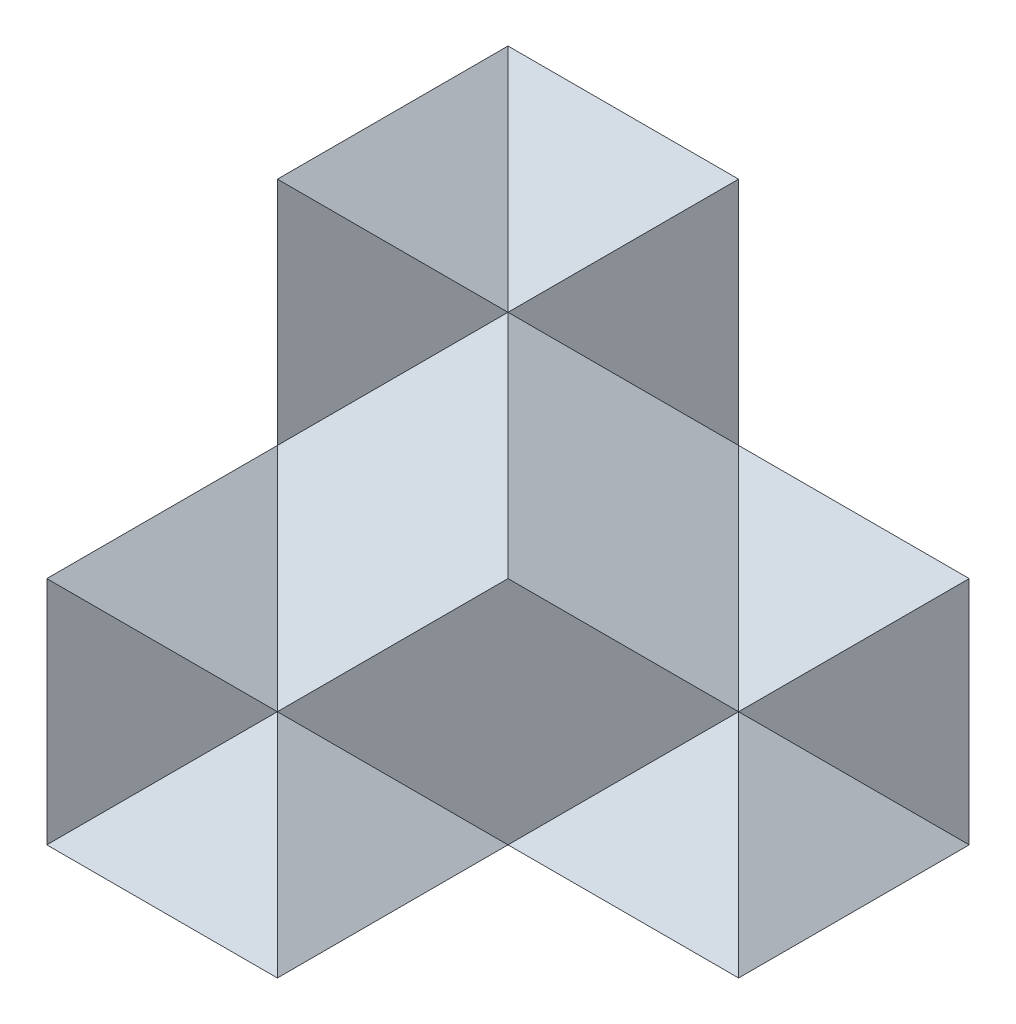
ISO-10303-21;
HEADER;
FILE_DESCRIPTION(('STEP AP214'),'2;1');
FILE_NAME('part.step','',(''),(''),'','','');
FILE_SCHEMA(('AUTOMOTIVE_DESIGN { 1 0 10303 214 1 1 1 1 }'));
ENDSEC;
DATA;
#1=APPLICATION_CONTEXT('core data for automotive mechanical design processes');
#2=APPLICATION_PROTOCOL_DEFINITION('international standard','automotive_design',2000,#1);
#3=PRODUCT_CONTEXT('',#1,'mechanical');
#4=PRODUCT('Part','Part','',(#3));
#5=PRODUCT_RELATED_PRODUCT_CATEGORY('part','',(#4));
#6=PRODUCT_DEFINITION_FORMATION('','',#4);
#7=PRODUCT_DEFINITION_CONTEXT('part definition',#1,'design');
#8=PRODUCT_DEFINITION('design','',#6,#7);
#9=PRODUCT_DEFINITION_SHAPE('','',#8);
#10=(LENGTH_UNIT() NAMED_UNIT(*) SI_UNIT(.MILLI.,.METRE.));
#11=(NAMED_UNIT(*) PLANE_ANGLE_UNIT() SI_UNIT($,.RADIAN.));
#12=(NAMED_UNIT(*) SI_UNIT($,.STERADIAN.) SOLID_ANGLE_UNIT());
#13=UNCERTAINTY_MEASURE_WITH_UNIT(LENGTH_MEASURE(1.E-05),#10,'distance_accuracy_value','');
#14=(GEOMETRIC_REPRESENTATION_CONTEXT(3) GLOBAL_UNCERTAINTY_ASSIGNED_CONTEXT((#13)) GLOBAL_UNIT_ASSIGNED_CONTEXT((#10,
#11,#12)) REPRESENTATION_CONTEXT('',''));
#15=CARTESIAN_POINT('',(0.,0.,0.));
#16=DIRECTION('',(0.,0.,1.));
#17=DIRECTION('',(1.,0.,0.));
#18=AXIS2_PLACEMENT_3D('',#15,#16,#17);
#19=CARTESIAN_POINT('',(25.4,0.,50.8));
#20=DIRECTION('',(0.707106781186546,0.707106781186549,0.));
#21=DIRECTION('',(0.707106781186549,-0.707106781186546,0.));
#22=AXIS2_PLACEMENT_3D('',#19,#20,#21);
#23=PLANE('',#22);
#24=DIRECTION('',(0.,0.,-1.));
#25=VECTOR('',#24,1.);
#26=CARTESIAN_POINT('',(25.4,0.,50.8));
#27=LINE('',#26,#25);
#28=CARTESIAN_POINT('',(25.4,0.,50.8));
#29=VERTEX_POINT('',#28);
#30=CARTESIAN_POINT('',(25.4,0.,25.4));
#31=VERTEX_POINT('',#30);
#32=EDGE_CURVE('E212',#29,#31,#27,.T.);
#33=ORIENTED_EDGE('',*,*,#32,.T.);
#34=DIRECTION('',(0.577350269189627,-0.577350269189626,-0.577350269189625));
#35=VECTOR('',#34,1.);
#36=CARTESIAN_POINT('',(16.9333333333333,8.46666666666668,33.8666666666667));
#37=LINE('',#36,#35);
#38=CARTESIAN_POINT('',(12.7,12.7,38.1));
#39=VERTEX_POINT('',#38);
#40=EDGE_CURVE('E226',#39,#31,#37,.T.);
#41=ORIENTED_EDGE('',*,*,#40,.F.);
#42=DIRECTION('',(0.577350269189627,-0.577350269189622,0.577350269189629));
#43=VECTOR('',#42,1.);
#44=CARTESIAN_POINT('',(25.4,0.,50.8));
#45=LINE('',#44,#43);
#46=EDGE_CURVE('E225',#39,#29,#45,.T.);
#47=ORIENTED_EDGE('',*,*,#46,.T.);
#48=EDGE_LOOP('',(#33,#41,#47));
#49=FACE_BOUND('',#48,.T.);
#50=ADVANCED_FACE('F40',(#49),#23,.T.);
#51=CARTESIAN_POINT('',(0.,0.,50.8));
#52=DIRECTION('',(0.,0.707106781186551,0.707106781186544));
#53=DIRECTION('',(0.,-0.707106781186544,0.707106781186551));
#54=AXIS2_PLACEMENT_3D('',#51,#52,#53);
#55=PLANE('',#54);
#56=DIRECTION('',(1.,0.,0.));
#57=VECTOR('',#56,1.);
#58=CARTESIAN_POINT('',(0.,0.,50.8));
#59=LINE('',#58,#57);
#60=CARTESIAN_POINT('',(0.,0.,50.8));
#61=VERTEX_POINT('',#60);
#62=EDGE_CURVE('E221',#61,#29,#59,.T.);
#63=ORIENTED_EDGE('',*,*,#62,.T.);
#64=ORIENTED_EDGE('',*,*,#46,.F.);
#65=DIRECTION('',(-0.577350269189627,-0.577350269189622,0.577350269189629));
#66=VECTOR('',#65,1.);
#67=CARTESIAN_POINT('',(0.,0.,50.8));
#68=LINE('',#67,#66);
#69=EDGE_CURVE('E231',#39,#61,#68,.T.);
#70=ORIENTED_EDGE('',*,*,#69,.T.);
#71=EDGE_LOOP('',(#63,#64,#70));
#72=FACE_BOUND('',#71,.T.);
#73=ADVANCED_FACE('F245',(#72),#55,.T.);
#74=CARTESIAN_POINT('',(0.,0.,50.8));
#75=DIRECTION('',(0.,-1.,0.));
#76=DIRECTION('',(-1.,0.,0.));
#77=AXIS2_PLACEMENT_3D('',#74,#75,#76);
#78=PLANE('',#77);
#79=ORIENTED_EDGE('',*,*,#32,.F.);
#80=ORIENTED_EDGE('',*,*,#62,.F.);
#81=DIRECTION('',(0.,0.,1.));
#82=VECTOR('',#81,1.);
#83=CARTESIAN_POINT('',(0.,0.,50.8));
#84=LINE('',#83,#82);
#85=CARTESIAN_POINT('',(0.,0.,0.));
#86=VERTEX_POINT('',#85);
#87=EDGE_CURVE('E218',#86,#61,#84,.T.);
#88=ORIENTED_EDGE('',*,*,#87,.F.);
#89=DIRECTION('',(1.,0.,0.));
#90=VECTOR('',#89,1.);
#91=CARTESIAN_POINT('',(0.,0.,0.));
#92=LINE('',#91,#90);
#93=CARTESIAN_POINT('',(50.8,0.,0.));
#94=VERTEX_POINT('',#93);
#95=EDGE_CURVE('E206',#86,#94,#92,.T.);
#96=ORIENTED_EDGE('',*,*,#95,.T.);
#97=DIRECTION('',(0.,0.,-1.));
#98=VECTOR('',#97,1.);
#99=CARTESIAN_POINT('',(50.8,0.,25.4));
#100=LINE('',#99,#98);
#101=CARTESIAN_POINT('',(50.8,0.,25.4));
#102=VERTEX_POINT('',#101);
#103=EDGE_CURVE('E179',#102,#94,#100,.T.);
#104=ORIENTED_EDGE('',*,*,#103,.F.);
#105=DIRECTION('',(1.,0.,0.));
#106=VECTOR('',#105,1.);
#107=CARTESIAN_POINT('',(25.4,0.,25.4));
#108=LINE('',#107,#106);
#109=EDGE_CURVE('E185',#31,#102,#108,.T.);
#110=ORIENTED_EDGE('',*,*,#109,.F.);
#111=EDGE_LOOP('',(#79,#80,#88,#96,#104,#110));
#112=FACE_BOUND('',#111,.T.);
#113=ADVANCED_FACE('F249',(#112),#78,.T.);
#114=CARTESIAN_POINT('',(25.4,0.,25.4));
#115=DIRECTION('',(0.707106781186546,0.,0.707106781186549));
#116=DIRECTION('',(0.707106781186549,0.,-0.707106781186546));
#117=AXIS2_PLACEMENT_3D('',#114,#115,#116);
#118=PLANE('',#117);
#119=ORIENTED_EDGE('',*,*,#40,.T.);
#120=DIRECTION('',(-0.577350269189627,-0.577350269189622,0.577350269189629));
#121=VECTOR('',#120,1.);
#122=CARTESIAN_POINT('',(25.4,0.,25.4));
#123=LINE('',#122,#121);
#124=CARTESIAN_POINT('',(38.1000000000001,12.7,12.7));
#125=VERTEX_POINT('',#124);
#126=EDGE_CURVE('E195',#125,#31,#123,.T.);
#127=ORIENTED_EDGE('',*,*,#126,.F.);
#128=DIRECTION('',(-0.577350269189622,0.577350269189627,0.577350269189629));
#129=VECTOR('',#128,1.);
#130=CARTESIAN_POINT('',(33.8666666666668,16.9333333333333,16.9333333333333));
#131=LINE('',#130,#129);
#132=CARTESIAN_POINT('',(25.4,25.4,25.4));
#133=VERTEX_POINT('',#132);
#134=EDGE_CURVE('E194',#125,#133,#131,.T.);
#135=ORIENTED_EDGE('',*,*,#134,.T.);
#136=DIRECTION('',(0.577350269189627,0.577350269189627,-0.577350269189624));
#137=VECTOR('',#136,1.);
#138=CARTESIAN_POINT('',(16.9333333333333,16.9333333333333,33.8666666666667));
#139=LINE('',#138,#137);
#140=EDGE_CURVE('E136',#39,#133,#139,.T.);
#141=ORIENTED_EDGE('',*,*,#140,.F.);
#142=EDGE_LOOP('',(#119,#127,#135,#141));
#143=FACE_BOUND('',#142,.T.);
#144=ADVANCED_FACE('F255',(#143),#118,.T.);
#145=CARTESIAN_POINT('',(0.,25.4,25.4));
#146=DIRECTION('',(0.,0.707106781186546,0.707106781186549));
#147=DIRECTION('',(0.,-0.707106781186549,0.707106781186546));
#148=AXIS2_PLACEMENT_3D('',#145,#146,#147);
#149=PLANE('',#148);
#150=ORIENTED_EDGE('',*,*,#140,.T.);
#151=DIRECTION('',(0.577350269189627,-0.577350269189622,0.577350269189629));
#152=VECTOR('',#151,1.);
#153=CARTESIAN_POINT('',(25.4,25.4000000000001,25.4));
#154=LINE('',#153,#152);
#155=CARTESIAN_POINT('',(12.7,38.1000000000001,12.7));
#156=VERTEX_POINT('',#155);
#157=EDGE_CURVE('E129',#156,#133,#154,.T.);
#158=ORIENTED_EDGE('',*,*,#157,.F.);
#159=DIRECTION('',(-0.577350269189627,-0.577350269189622,0.577350269189629));
#160=VECTOR('',#159,1.);
#161=CARTESIAN_POINT('',(0.,25.4000000000001,25.4));
#162=LINE('',#161,#160);
#163=CARTESIAN_POINT('',(0.,25.4,25.4));
#164=VERTEX_POINT('',#163);
#165=EDGE_CURVE('E121',#156,#164,#162,.T.);
#166=ORIENTED_EDGE('',*,*,#165,.T.);
#167=DIRECTION('',(-0.577350269189627,0.577350269189627,-0.577350269189624));
#168=VECTOR('',#167,1.);
#169=CARTESIAN_POINT('',(8.46666666666669,16.9333333333333,33.8666666666667));
#170=LINE('',#169,#168);
#171=EDGE_CURVE('E209',#39,#164,#170,.T.);
#172=ORIENTED_EDGE('',*,*,#171,.F.);
#173=EDGE_LOOP('',(#150,#158,#166,#172));
#174=FACE_BOUND('',#173,.T.);
#175=ADVANCED_FACE('F134',(#174),#149,.T.);
#176=CARTESIAN_POINT('',(0.,25.4,50.8));
#177=DIRECTION('',(0.707106781186549,0.707106781186546,0.));
#178=DIRECTION('',(0.707106781186546,-0.707106781186549,0.));
#179=AXIS2_PLACEMENT_3D('',#176,#177,#178);
#180=PLANE('',#179);
#181=DIRECTION('',(0.,0.,1.));
#182=VECTOR('',#181,1.);
#183=CARTESIAN_POINT('',(0.,25.4,50.8));
#184=LINE('',#183,#182);
#185=CARTESIAN_POINT('',(0.,25.4,50.8));
#186=VERTEX_POINT('',#185);
#187=EDGE_CURVE('E230',#164,#186,#184,.T.);
#188=ORIENTED_EDGE('',*,*,#187,.T.);
#189=DIRECTION('',(-0.577350269189622,0.577350269189627,0.577350269189629));
#190=VECTOR('',#189,1.);
#191=CARTESIAN_POINT('',(8.46666666666672,16.9333333333333,42.3333333333333));
#192=LINE('',#191,#190);
#193=EDGE_CURVE('E11',#39,#186,#192,.T.);
#194=ORIENTED_EDGE('',*,*,#193,.F.);
#195=ORIENTED_EDGE('',*,*,#171,.T.);
#196=EDGE_LOOP('',(#188,#194,#195));
#197=FACE_BOUND('',#196,.T.);
#198=ADVANCED_FACE('F42',(#197),#180,.T.);
#199=CARTESIAN_POINT('',(0.,0.,50.8));
#200=DIRECTION('',(0.707106781186551,0.,0.707106781186544));
#201=DIRECTION('',(0.707106781186544,0.,-0.707106781186551));
#202=AXIS2_PLACEMENT_3D('',#199,#200,#201);
#203=PLANE('',#202);
#204=DIRECTION('',(0.,-1.,0.));
#205=VECTOR('',#204,1.);
#206=CARTESIAN_POINT('',(0.,0.,50.8));
#207=LINE('',#206,#205);
#208=EDGE_CURVE('E49',#186,#61,#207,.T.);
#209=ORIENTED_EDGE('',*,*,#208,.T.);
#210=ORIENTED_EDGE('',*,*,#69,.F.);
#211=ORIENTED_EDGE('',*,*,#193,.T.);
#212=EDGE_LOOP('',(#209,#210,#211));
#213=FACE_BOUND('',#212,.T.);
#214=ADVANCED_FACE('F240',(#213),#203,.T.);
#215=CARTESIAN_POINT('',(0.,0.,50.8));
#216=DIRECTION('',(-1.,0.,0.));
#217=DIRECTION('',(0.,0.,1.));
#218=AXIS2_PLACEMENT_3D('',#215,#216,#217);
#219=PLANE('',#218);
#220=ORIENTED_EDGE('',*,*,#187,.F.);
#221=DIRECTION('',(0.,-1.,0.));
#222=VECTOR('',#221,1.);
#223=CARTESIAN_POINT('',(0.,25.4,25.4));
#224=LINE('',#223,#222);
#225=CARTESIAN_POINT('',(0.,50.8,25.4));
#226=VERTEX_POINT('',#225);
#227=EDGE_CURVE('E118',#226,#164,#224,.T.);
#228=ORIENTED_EDGE('',*,*,#227,.F.);
#229=DIRECTION('',(0.,0.,1.));
#230=VECTOR('',#229,1.);
#231=CARTESIAN_POINT('',(0.,50.8,25.4));
#232=LINE('',#231,#230);
#233=CARTESIAN_POINT('',(0.,50.8,0.));
#234=VERTEX_POINT('',#233);
#235=EDGE_CURVE('E113',#234,#226,#232,.T.);
#236=ORIENTED_EDGE('',*,*,#235,.F.);
#237=DIRECTION('',(0.,-1.,0.));
#238=VECTOR('',#237,1.);
#239=CARTESIAN_POINT('',(0.,0.,0.));
#240=LINE('',#239,#238);
#241=EDGE_CURVE('E202',#234,#86,#240,.T.);
#242=ORIENTED_EDGE('',*,*,#241,.T.);
#243=ORIENTED_EDGE('',*,*,#87,.T.);
#244=ORIENTED_EDGE('',*,*,#208,.F.);
#245=EDGE_LOOP('',(#220,#228,#236,#242,#243,#244));
#246=FACE_BOUND('',#245,.T.);
#247=ADVANCED_FACE('F271',(#246),#219,.T.);
#248=CARTESIAN_POINT('',(0.,0.,0.));
#249=DIRECTION('',(0.,0.,-1.));
#250=DIRECTION('',(-1.,0.,0.));
#251=AXIS2_PLACEMENT_3D('',#248,#249,#250);
#252=PLANE('',#251);
#253=ORIENTED_EDGE('',*,*,#241,.F.);
#254=DIRECTION('',(-1.,0.,0.));
#255=VECTOR('',#254,1.);
#256=CARTESIAN_POINT('',(0.,50.8,0.));
#257=LINE('',#256,#255);
#258=CARTESIAN_POINT('',(25.4,50.8,0.));
#259=VERTEX_POINT('',#258);
#260=EDGE_CURVE('E151',#259,#234,#257,.T.);
#261=ORIENTED_EDGE('',*,*,#260,.F.);
#262=DIRECTION('',(0.,1.,0.));
#263=VECTOR('',#262,1.);
#264=CARTESIAN_POINT('',(25.4,25.4,0.));
#265=LINE('',#264,#263);
#266=CARTESIAN_POINT('',(25.4,25.4,0.));
#267=VERTEX_POINT('',#266);
#268=EDGE_CURVE('E128',#267,#259,#265,.T.);
#269=ORIENTED_EDGE('',*,*,#268,.F.);
#270=DIRECTION('',(-1.,0.,0.));
#271=VECTOR('',#270,1.);
#272=CARTESIAN_POINT('',(25.4,25.4,0.));
#273=LINE('',#272,#271);
#274=CARTESIAN_POINT('',(50.8,25.4,0.));
#275=VERTEX_POINT('',#274);
#276=EDGE_CURVE('E172',#275,#267,#273,.T.);
#277=ORIENTED_EDGE('',*,*,#276,.F.);
#278=DIRECTION('',(0.,1.,0.));
#279=VECTOR('',#278,1.);
#280=CARTESIAN_POINT('',(50.8,0.,0.));
#281=LINE('',#280,#279);
#282=EDGE_CURVE('E117',#94,#275,#281,.T.);
#283=ORIENTED_EDGE('',*,*,#282,.F.);
#284=ORIENTED_EDGE('',*,*,#95,.F.);
#285=EDGE_LOOP('',(#253,#261,#269,#277,#283,#284));
#286=FACE_BOUND('',#285,.T.);
#287=ADVANCED_FACE('F270',(#286),#252,.T.);
#288=CARTESIAN_POINT('',(50.8,0.,25.4));
#289=DIRECTION('',(0.707106781186546,0.707106781186549,0.));
#290=DIRECTION('',(0.707106781186549,-0.707106781186546,0.));
#291=AXIS2_PLACEMENT_3D('',#288,#289,#290);
#292=PLANE('',#291);
#293=ORIENTED_EDGE('',*,*,#103,.T.);
#294=DIRECTION('',(0.577350269189627,-0.577350269189626,-0.577350269189625));
#295=VECTOR('',#294,1.);
#296=CARTESIAN_POINT('',(42.3333333333334,8.46666666666668,8.4666666666667));
#297=LINE('',#296,#295);
#298=EDGE_CURVE('E190',#125,#94,#297,.T.);
#299=ORIENTED_EDGE('',*,*,#298,.F.);
#300=DIRECTION('',(0.577350269189627,-0.577350269189622,0.577350269189629));
#301=VECTOR('',#300,1.);
#302=CARTESIAN_POINT('',(50.8,0.,25.4));
#303=LINE('',#302,#301);
#304=EDGE_CURVE('E189',#125,#102,#303,.T.);
#305=ORIENTED_EDGE('',*,*,#304,.T.);
#306=EDGE_LOOP('',(#293,#299,#305));
#307=FACE_BOUND('',#306,.T.);
#308=ADVANCED_FACE('F261',(#307),#292,.T.);
#309=CARTESIAN_POINT('',(25.4,0.,25.4));
#310=DIRECTION('',(0.,0.707106781186551,0.707106781186544));
#311=DIRECTION('',(0.,-0.707106781186544,0.707106781186551));
#312=AXIS2_PLACEMENT_3D('',#309,#310,#311);
#313=PLANE('',#312);
#314=ORIENTED_EDGE('',*,*,#109,.T.);
#315=ORIENTED_EDGE('',*,*,#304,.F.);
#316=ORIENTED_EDGE('',*,*,#126,.T.);
#317=EDGE_LOOP('',(#314,#315,#316));
#318=FACE_BOUND('',#317,.T.);
#319=ADVANCED_FACE('F259',(#318),#313,.T.);
#320=CARTESIAN_POINT('',(50.8,0.,0.));
#321=DIRECTION('',(0.707106781186546,0.,0.707106781186549));
#322=DIRECTION('',(0.707106781186549,0.,-0.707106781186546));
#323=AXIS2_PLACEMENT_3D('',#320,#321,#322);
#324=PLANE('',#323);
#325=ORIENTED_EDGE('',*,*,#282,.T.);
#326=DIRECTION('',(0.577350269189627,0.577350269189627,-0.577350269189624));
#327=VECTOR('',#326,1.);
#328=CARTESIAN_POINT('',(42.3333333333334,16.9333333333333,8.4666666666667));
#329=LINE('',#328,#327);
#330=EDGE_CURVE('E175',#125,#275,#329,.T.);
#331=ORIENTED_EDGE('',*,*,#330,.F.);
#332=ORIENTED_EDGE('',*,*,#298,.T.);
#333=EDGE_LOOP('',(#325,#331,#332));
#334=FACE_BOUND('',#333,.T.);
#335=ADVANCED_FACE('F267',(#334),#324,.T.);
#336=CARTESIAN_POINT('',(25.4,25.4,0.));
#337=DIRECTION('',(0.,0.707106781186546,0.707106781186549));
#338=DIRECTION('',(0.,-0.707106781186549,0.707106781186546));
#339=AXIS2_PLACEMENT_3D('',#336,#337,#338);
#340=PLANE('',#339);
#341=ORIENTED_EDGE('',*,*,#276,.T.);
#342=DIRECTION('',(-0.577350269189627,0.577350269189627,-0.577350269189624));
#343=VECTOR('',#342,1.);
#344=CARTESIAN_POINT('',(33.8666666666667,16.9333333333333,8.4666666666667));
#345=LINE('',#344,#343);
#346=EDGE_CURVE('E145',#125,#267,#345,.T.);
#347=ORIENTED_EDGE('',*,*,#346,.F.);
#348=ORIENTED_EDGE('',*,*,#330,.T.);
#349=EDGE_LOOP('',(#341,#347,#348));
#350=FACE_BOUND('',#349,.T.);
#351=ADVANCED_FACE('F266',(#350),#340,.T.);
#352=CARTESIAN_POINT('',(25.4000000000001,25.4,25.4));
#353=DIRECTION('',(0.707106781186549,0.707106781186546,0.));
#354=DIRECTION('',(0.707106781186546,-0.707106781186549,0.));
#355=AXIS2_PLACEMENT_3D('',#352,#353,#354);
#356=PLANE('',#355);
#357=ORIENTED_EDGE('',*,*,#346,.T.);
#358=DIRECTION('',(0.577350269189627,-0.577350269189626,-0.577350269189625));
#359=VECTOR('',#358,1.);
#360=CARTESIAN_POINT('',(16.9333333333333,33.8666666666667,8.4666666666667));
#361=LINE('',#360,#359);
#362=EDGE_CURVE('E142',#156,#267,#361,.T.);
#363=ORIENTED_EDGE('',*,*,#362,.F.);
#364=ORIENTED_EDGE('',*,*,#157,.T.);
#365=ORIENTED_EDGE('',*,*,#134,.F.);
#366=EDGE_LOOP('',(#357,#363,#364,#365));
#367=FACE_BOUND('',#366,.T.);
#368=ADVANCED_FACE('F143',(#367),#356,.T.);
#369=CARTESIAN_POINT('',(25.4,25.4,0.));
#370=DIRECTION('',(0.707106781186546,0.,0.707106781186549));
#371=DIRECTION('',(0.707106781186549,0.,-0.707106781186546));
#372=AXIS2_PLACEMENT_3D('',#369,#370,#371);
#373=PLANE('',#372);
#374=ORIENTED_EDGE('',*,*,#268,.T.);
#375=DIRECTION('',(0.577350269189627,0.577350269189627,-0.577350269189624));
#376=VECTOR('',#375,1.);
#377=CARTESIAN_POINT('',(16.9333333333333,42.3333333333334,8.4666666666667));
#378=LINE('',#377,#376);
#379=EDGE_CURVE('E156',#156,#259,#378,.T.);
#380=ORIENTED_EDGE('',*,*,#379,.F.);
#381=ORIENTED_EDGE('',*,*,#362,.T.);
#382=EDGE_LOOP('',(#374,#380,#381));
#383=FACE_BOUND('',#382,.T.);
#384=ADVANCED_FACE('F159',(#383),#373,.T.);
#385=CARTESIAN_POINT('',(0.,50.8,0.));
#386=DIRECTION('',(0.,0.707106781186546,0.707106781186549));
#387=DIRECTION('',(0.,-0.707106781186549,0.707106781186546));
#388=AXIS2_PLACEMENT_3D('',#385,#386,#387);
#389=PLANE('',#388);
#390=ORIENTED_EDGE('',*,*,#260,.T.);
#391=DIRECTION('',(-0.577350269189627,0.577350269189627,-0.577350269189624));
#392=VECTOR('',#391,1.);
#393=CARTESIAN_POINT('',(8.46666666666669,42.3333333333334,8.4666666666667));
#394=LINE('',#393,#392);
#395=EDGE_CURVE('E110',#156,#234,#394,.T.);
#396=ORIENTED_EDGE('',*,*,#395,.F.);
#397=ORIENTED_EDGE('',*,*,#379,.T.);
#398=EDGE_LOOP('',(#390,#396,#397));
#399=FACE_BOUND('',#398,.T.);
#400=ADVANCED_FACE('F155',(#399),#389,.T.);
#401=CARTESIAN_POINT('',(0.,50.8,25.4));
#402=DIRECTION('',(0.707106781186549,0.707106781186546,0.));
#403=DIRECTION('',(0.707106781186546,-0.707106781186549,0.));
#404=AXIS2_PLACEMENT_3D('',#401,#402,#403);
#405=PLANE('',#404);
#406=ORIENTED_EDGE('',*,*,#235,.T.);
#407=DIRECTION('',(-0.577350269189622,0.577350269189627,0.577350269189629));
#408=VECTOR('',#407,1.);
#409=CARTESIAN_POINT('',(8.46666666666672,42.3333333333334,16.9333333333333));
#410=LINE('',#409,#408);
#411=EDGE_CURVE('E106',#156,#226,#410,.T.);
#412=ORIENTED_EDGE('',*,*,#411,.F.);
#413=ORIENTED_EDGE('',*,*,#395,.T.);
#414=EDGE_LOOP('',(#406,#412,#413));
#415=FACE_BOUND('',#414,.T.);
#416=ADVANCED_FACE('F108',(#415),#405,.T.);
#417=CARTESIAN_POINT('',(0.,25.4,25.4));
#418=DIRECTION('',(0.707106781186551,0.,0.707106781186544));
#419=DIRECTION('',(0.707106781186544,0.,-0.707106781186551));
#420=AXIS2_PLACEMENT_3D('',#417,#418,#419);
#421=PLANE('',#420);
#422=ORIENTED_EDGE('',*,*,#227,.T.);
#423=ORIENTED_EDGE('',*,*,#165,.F.);
#424=ORIENTED_EDGE('',*,*,#411,.T.);
#425=EDGE_LOOP('',(#422,#423,#424));
#426=FACE_BOUND('',#425,.T.);
#427=ADVANCED_FACE('F123',(#426),#421,.T.);
#428=CLOSED_SHELL('',(#50,#73,#113,#144,#175,#198,#214,#247,#287,#308,#319,#335,#351,#368,#384,
#400,#416,#427));
#429=MANIFOLD_SOLID_BREP('B2',#428);
#430=ADVANCED_BREP_SHAPE_REPRESENTATION('',(#18,#429),#14);
#431=SHAPE_DEFINITION_REPRESENTATION(#9,#430);
ENDSEC;
END-ISO-10303-21;
